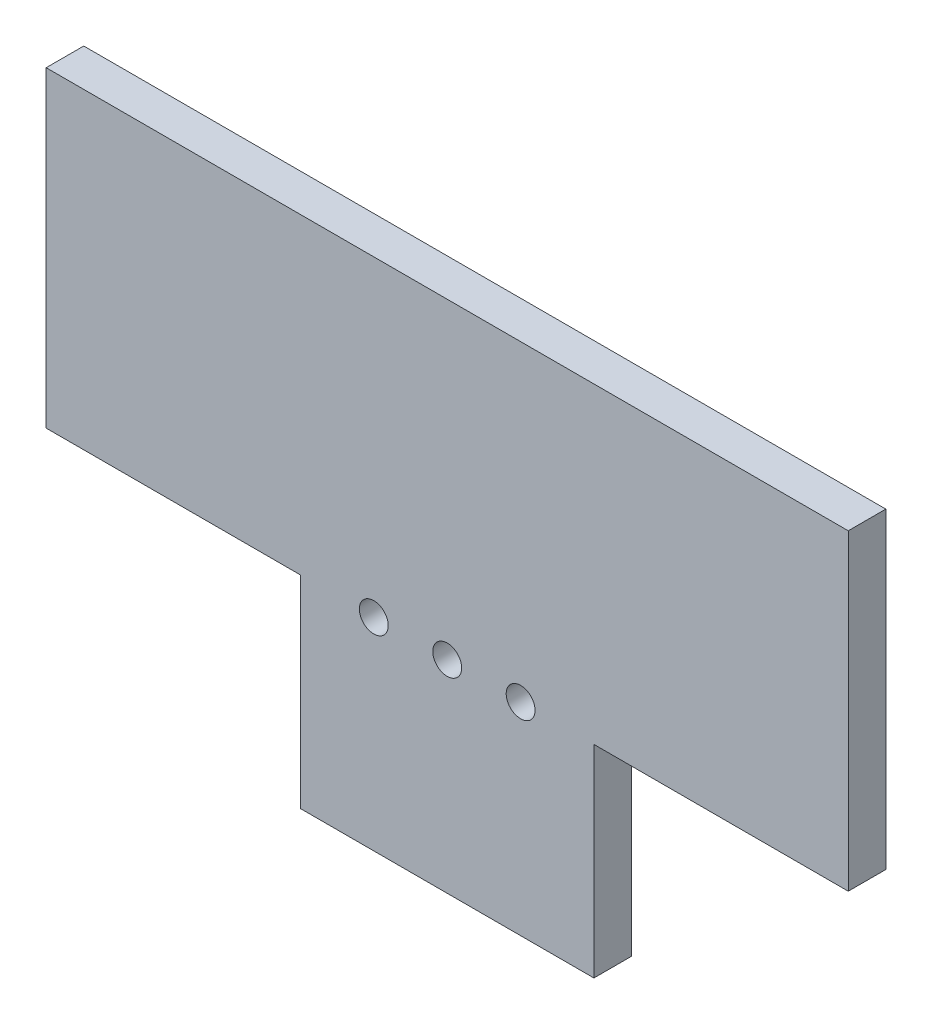
ISO-10303-21;
HEADER;
FILE_DESCRIPTION(('STEP AP214'),'2;1');
FILE_NAME('part.step','',(''),(''),'','','');
FILE_SCHEMA(('AUTOMOTIVE_DESIGN { 1 0 10303 214 1 1 1 1 }'));
ENDSEC;
DATA;
#1=APPLICATION_CONTEXT('core data for automotive mechanical design processes');
#2=APPLICATION_PROTOCOL_DEFINITION('international standard','automotive_design',2000,#1);
#3=PRODUCT_CONTEXT('',#1,'mechanical');
#4=PRODUCT('Part','Part','',(#3));
#5=PRODUCT_RELATED_PRODUCT_CATEGORY('part','',(#4));
#6=PRODUCT_DEFINITION_FORMATION('','',#4);
#7=PRODUCT_DEFINITION_CONTEXT('part definition',#1,'design');
#8=PRODUCT_DEFINITION('design','',#6,#7);
#9=PRODUCT_DEFINITION_SHAPE('','',#8);
#10=(LENGTH_UNIT() NAMED_UNIT(*) SI_UNIT(.MILLI.,.METRE.));
#11=(NAMED_UNIT(*) PLANE_ANGLE_UNIT() SI_UNIT($,.RADIAN.));
#12=(NAMED_UNIT(*) SI_UNIT($,.STERADIAN.) SOLID_ANGLE_UNIT());
#13=UNCERTAINTY_MEASURE_WITH_UNIT(LENGTH_MEASURE(1.E-05),#10,'distance_accuracy_value','');
#14=(GEOMETRIC_REPRESENTATION_CONTEXT(3) GLOBAL_UNCERTAINTY_ASSIGNED_CONTEXT((#13)) GLOBAL_UNIT_ASSIGNED_CONTEXT((#10,
#11,#12)) REPRESENTATION_CONTEXT('',''));
#15=CARTESIAN_POINT('',(0.,0.,0.));
#16=DIRECTION('',(0.,0.,1.));
#17=DIRECTION('',(1.,0.,0.));
#18=AXIS2_PLACEMENT_3D('',#15,#16,#17);
#19=CARTESIAN_POINT('',(-5.075,-12.4,0.65));
#20=DIRECTION('',(0.,1.,0.));
#21=DIRECTION('',(0.,0.,1.));
#22=AXIS2_PLACEMENT_3D('',#19,#20,#21);
#23=PLANE('',#22);
#24=DIRECTION('',(1.,0.,0.));
#25=VECTOR('',#24,1.);
#26=CARTESIAN_POINT('',(-5.075,-12.4,-0.65));
#27=LINE('',#26,#25);
#28=CARTESIAN_POINT('',(-5.075,-12.4,-0.65));
#29=VERTEX_POINT('',#28);
#30=CARTESIAN_POINT('',(5.075,-12.4,-0.65));
#31=VERTEX_POINT('',#30);
#32=EDGE_CURVE('E132',#29,#31,#27,.T.);
#33=ORIENTED_EDGE('',*,*,#32,.T.);
#34=DIRECTION('',(0.,0.,-1.));
#35=VECTOR('',#34,1.);
#36=CARTESIAN_POINT('',(5.075,-12.4,0.65));
#37=LINE('',#36,#35);
#38=CARTESIAN_POINT('',(5.075,-12.4,0.65));
#39=VERTEX_POINT('',#38);
#40=EDGE_CURVE('E160',#39,#31,#37,.T.);
#41=ORIENTED_EDGE('',*,*,#40,.F.);
#42=DIRECTION('',(1.,0.,0.));
#43=VECTOR('',#42,1.);
#44=CARTESIAN_POINT('',(-5.075,-12.4,0.65));
#45=LINE('',#44,#43);
#46=CARTESIAN_POINT('',(-5.075,-12.4,0.65));
#47=VERTEX_POINT('',#46);
#48=EDGE_CURVE('E147',#47,#39,#45,.T.);
#49=ORIENTED_EDGE('',*,*,#48,.F.);
#50=DIRECTION('',(0.,0.,-1.));
#51=VECTOR('',#50,1.);
#52=CARTESIAN_POINT('',(-5.075,-12.4,0.65));
#53=LINE('',#52,#51);
#54=EDGE_CURVE('E128',#47,#29,#53,.T.);
#55=ORIENTED_EDGE('',*,*,#54,.T.);
#56=EDGE_LOOP('',(#33,#41,#49,#55));
#57=FACE_BOUND('',#56,.T.);
#58=ADVANCED_FACE('F33',(#57),#23,.F.);
#59=CARTESIAN_POINT('',(5.075,-12.4,0.65));
#60=DIRECTION('',(-1.,0.,0.));
#61=DIRECTION('',(0.,0.,1.));
#62=AXIS2_PLACEMENT_3D('',#59,#60,#61);
#63=PLANE('',#62);
#64=DIRECTION('',(0.,1.,0.));
#65=VECTOR('',#64,1.);
#66=CARTESIAN_POINT('',(5.075,-12.4,-0.65));
#67=LINE('',#66,#65);
#68=CARTESIAN_POINT('',(5.075,-5.4,-0.65));
#69=VERTEX_POINT('',#68);
#70=EDGE_CURVE('E135',#31,#69,#67,.T.);
#71=ORIENTED_EDGE('',*,*,#70,.T.);
#72=DIRECTION('',(0.,0.,-1.));
#73=VECTOR('',#72,1.);
#74=CARTESIAN_POINT('',(5.075,-5.4,0.65));
#75=LINE('',#74,#73);
#76=CARTESIAN_POINT('',(5.075,-5.4,0.65));
#77=VERTEX_POINT('',#76);
#78=EDGE_CURVE('E157',#77,#69,#75,.T.);
#79=ORIENTED_EDGE('',*,*,#78,.F.);
#80=DIRECTION('',(0.,1.,0.));
#81=VECTOR('',#80,1.);
#82=CARTESIAN_POINT('',(5.075,-12.4,0.65));
#83=LINE('',#82,#81);
#84=EDGE_CURVE('E94',#39,#77,#83,.T.);
#85=ORIENTED_EDGE('',*,*,#84,.F.);
#86=ORIENTED_EDGE('',*,*,#40,.T.);
#87=EDGE_LOOP('',(#71,#79,#85,#86));
#88=FACE_BOUND('',#87,.T.);
#89=ADVANCED_FACE('F182',(#88),#63,.F.);
#90=CARTESIAN_POINT('',(5.075,-5.4,0.65));
#91=DIRECTION('',(0.,1.,0.));
#92=DIRECTION('',(0.,0.,1.));
#93=AXIS2_PLACEMENT_3D('',#90,#91,#92);
#94=PLANE('',#93);
#95=DIRECTION('',(1.,0.,0.));
#96=VECTOR('',#95,1.);
#97=CARTESIAN_POINT('',(5.075,-5.4,-0.65));
#98=LINE('',#97,#96);
#99=CARTESIAN_POINT('',(13.875,-5.4,-0.65));
#100=VERTEX_POINT('',#99);
#101=EDGE_CURVE('E138',#69,#100,#98,.T.);
#102=ORIENTED_EDGE('',*,*,#101,.T.);
#103=DIRECTION('',(0.,0.,-1.));
#104=VECTOR('',#103,1.);
#105=CARTESIAN_POINT('',(13.875,-5.4,0.65));
#106=LINE('',#105,#104);
#107=CARTESIAN_POINT('',(13.875,-5.4,0.65));
#108=VERTEX_POINT('',#107);
#109=EDGE_CURVE('E154',#108,#100,#106,.T.);
#110=ORIENTED_EDGE('',*,*,#109,.F.);
#111=DIRECTION('',(1.,0.,0.));
#112=VECTOR('',#111,1.);
#113=CARTESIAN_POINT('',(5.075,-5.4,0.65));
#114=LINE('',#113,#112);
#115=EDGE_CURVE('E267',#77,#108,#114,.T.);
#116=ORIENTED_EDGE('',*,*,#115,.F.);
#117=ORIENTED_EDGE('',*,*,#78,.T.);
#118=EDGE_LOOP('',(#102,#110,#116,#117));
#119=FACE_BOUND('',#118,.T.);
#120=ADVANCED_FACE('F187',(#119),#94,.F.);
#121=CARTESIAN_POINT('',(13.875,-5.4,0.65));
#122=DIRECTION('',(-1.,0.,0.));
#123=DIRECTION('',(0.,0.,1.));
#124=AXIS2_PLACEMENT_3D('',#121,#122,#123);
#125=PLANE('',#124);
#126=DIRECTION('',(0.,1.,0.));
#127=VECTOR('',#126,1.);
#128=CARTESIAN_POINT('',(13.875,-5.4,-0.65));
#129=LINE('',#128,#127);
#130=CARTESIAN_POINT('',(13.875,5.4,-0.65));
#131=VERTEX_POINT('',#130);
#132=EDGE_CURVE('E140',#100,#131,#129,.T.);
#133=ORIENTED_EDGE('',*,*,#132,.T.);
#134=DIRECTION('',(0.,0.,-1.));
#135=VECTOR('',#134,1.);
#136=CARTESIAN_POINT('',(13.875,5.4,0.65));
#137=LINE('',#136,#135);
#138=CARTESIAN_POINT('',(13.875,5.4,0.65));
#139=VERTEX_POINT('',#138);
#140=EDGE_CURVE('E151',#139,#131,#137,.T.);
#141=ORIENTED_EDGE('',*,*,#140,.F.);
#142=DIRECTION('',(0.,1.,0.));
#143=VECTOR('',#142,1.);
#144=CARTESIAN_POINT('',(13.875,-5.4,0.65));
#145=LINE('',#144,#143);
#146=EDGE_CURVE('E269',#108,#139,#145,.T.);
#147=ORIENTED_EDGE('',*,*,#146,.F.);
#148=ORIENTED_EDGE('',*,*,#109,.T.);
#149=EDGE_LOOP('',(#133,#141,#147,#148));
#150=FACE_BOUND('',#149,.T.);
#151=ADVANCED_FACE('F192',(#150),#125,.F.);
#152=CARTESIAN_POINT('',(13.875,5.4,0.65));
#153=DIRECTION('',(0.,-1.,0.));
#154=DIRECTION('',(0.,0.,-1.));
#155=AXIS2_PLACEMENT_3D('',#152,#153,#154);
#156=PLANE('',#155);
#157=DIRECTION('',(-1.,0.,0.));
#158=VECTOR('',#157,1.);
#159=CARTESIAN_POINT('',(13.875,5.4,-0.65));
#160=LINE('',#159,#158);
#161=CARTESIAN_POINT('',(-13.875,5.4,-0.65));
#162=VERTEX_POINT('',#161);
#163=EDGE_CURVE('E142',#131,#162,#160,.T.);
#164=ORIENTED_EDGE('',*,*,#163,.T.);
#165=DIRECTION('',(0.,0.,-1.));
#166=VECTOR('',#165,1.);
#167=CARTESIAN_POINT('',(-13.875,5.4,0.65));
#168=LINE('',#167,#166);
#169=CARTESIAN_POINT('',(-13.875,5.4,0.65));
#170=VERTEX_POINT('',#169);
#171=EDGE_CURVE('E123',#170,#162,#168,.T.);
#172=ORIENTED_EDGE('',*,*,#171,.F.);
#173=DIRECTION('',(-1.,0.,0.));
#174=VECTOR('',#173,1.);
#175=CARTESIAN_POINT('',(13.875,5.4,0.65));
#176=LINE('',#175,#174);
#177=EDGE_CURVE('E114',#139,#170,#176,.T.);
#178=ORIENTED_EDGE('',*,*,#177,.F.);
#179=ORIENTED_EDGE('',*,*,#140,.T.);
#180=EDGE_LOOP('',(#164,#172,#178,#179));
#181=FACE_BOUND('',#180,.T.);
#182=ADVANCED_FACE('F196',(#181),#156,.F.);
#183=CARTESIAN_POINT('',(-13.875,5.4,0.65));
#184=DIRECTION('',(1.,0.,0.));
#185=DIRECTION('',(0.,0.,-1.));
#186=AXIS2_PLACEMENT_3D('',#183,#184,#185);
#187=PLANE('',#186);
#188=DIRECTION('',(0.,-1.,0.));
#189=VECTOR('',#188,1.);
#190=CARTESIAN_POINT('',(-13.875,5.4,-0.65));
#191=LINE('',#190,#189);
#192=CARTESIAN_POINT('',(-13.875,-5.4,-0.65));
#193=VERTEX_POINT('',#192);
#194=EDGE_CURVE('E122',#162,#193,#191,.T.);
#195=ORIENTED_EDGE('',*,*,#194,.T.);
#196=DIRECTION('',(0.,0.,-1.));
#197=VECTOR('',#196,1.);
#198=CARTESIAN_POINT('',(-13.875,-5.4,0.65));
#199=LINE('',#198,#197);
#200=CARTESIAN_POINT('',(-13.875,-5.4,0.65));
#201=VERTEX_POINT('',#200);
#202=EDGE_CURVE('E119',#201,#193,#199,.T.);
#203=ORIENTED_EDGE('',*,*,#202,.F.);
#204=DIRECTION('',(0.,-1.,0.));
#205=VECTOR('',#204,1.);
#206=CARTESIAN_POINT('',(-13.875,5.4,0.65));
#207=LINE('',#206,#205);
#208=EDGE_CURVE('E107',#170,#201,#207,.T.);
#209=ORIENTED_EDGE('',*,*,#208,.F.);
#210=ORIENTED_EDGE('',*,*,#171,.T.);
#211=EDGE_LOOP('',(#195,#203,#209,#210));
#212=FACE_BOUND('',#211,.T.);
#213=ADVANCED_FACE('F120',(#212),#187,.F.);
#214=CARTESIAN_POINT('',(-13.875,-5.4,0.65));
#215=DIRECTION('',(0.,1.,0.));
#216=DIRECTION('',(0.,0.,1.));
#217=AXIS2_PLACEMENT_3D('',#214,#215,#216);
#218=PLANE('',#217);
#219=DIRECTION('',(1.,0.,0.));
#220=VECTOR('',#219,1.);
#221=CARTESIAN_POINT('',(-13.875,-5.4,-0.65));
#222=LINE('',#221,#220);
#223=CARTESIAN_POINT('',(-5.075,-5.4,-0.65));
#224=VERTEX_POINT('',#223);
#225=EDGE_CURVE('E79',#193,#224,#222,.T.);
#226=ORIENTED_EDGE('',*,*,#225,.T.);
#227=DIRECTION('',(0.,0.,-1.));
#228=VECTOR('',#227,1.);
#229=CARTESIAN_POINT('',(-5.075,-5.4,0.65));
#230=LINE('',#229,#228);
#231=CARTESIAN_POINT('',(-5.075,-5.4,0.65));
#232=VERTEX_POINT('',#231);
#233=EDGE_CURVE('E124',#232,#224,#230,.T.);
#234=ORIENTED_EDGE('',*,*,#233,.F.);
#235=DIRECTION('',(1.,0.,0.));
#236=VECTOR('',#235,1.);
#237=CARTESIAN_POINT('',(-13.875,-5.4,0.65));
#238=LINE('',#237,#236);
#239=EDGE_CURVE('E112',#201,#232,#238,.T.);
#240=ORIENTED_EDGE('',*,*,#239,.F.);
#241=ORIENTED_EDGE('',*,*,#202,.T.);
#242=EDGE_LOOP('',(#226,#234,#240,#241));
#243=FACE_BOUND('',#242,.T.);
#244=ADVANCED_FACE('F126',(#243),#218,.F.);
#245=CARTESIAN_POINT('',(-5.075,-5.4,0.65));
#246=DIRECTION('',(1.,0.,0.));
#247=DIRECTION('',(0.,0.,-1.));
#248=AXIS2_PLACEMENT_3D('',#245,#246,#247);
#249=PLANE('',#248);
#250=DIRECTION('',(0.,-1.,0.));
#251=VECTOR('',#250,1.);
#252=CARTESIAN_POINT('',(-5.075,-5.4,-0.65));
#253=LINE('',#252,#251);
#254=EDGE_CURVE('E85',#224,#29,#253,.T.);
#255=ORIENTED_EDGE('',*,*,#254,.T.);
#256=ORIENTED_EDGE('',*,*,#54,.F.);
#257=DIRECTION('',(0.,-1.,0.));
#258=VECTOR('',#257,1.);
#259=CARTESIAN_POINT('',(-5.075,-5.4,0.65));
#260=LINE('',#259,#258);
#261=EDGE_CURVE('E50',#232,#47,#260,.T.);
#262=ORIENTED_EDGE('',*,*,#261,.F.);
#263=ORIENTED_EDGE('',*,*,#233,.T.);
#264=EDGE_LOOP('',(#255,#256,#262,#263));
#265=FACE_BOUND('',#264,.T.);
#266=ADVANCED_FACE('F167',(#265),#249,.F.);
#267=CARTESIAN_POINT('',(5.075,-12.4,0.65));
#268=DIRECTION('',(0.,0.,1.));
#269=DIRECTION('',(1.,0.,0.));
#270=AXIS2_PLACEMENT_3D('',#267,#268,#269);
#271=PLANE('',#270);
#272=CARTESIAN_POINT('',(0.,-5.4,0.65));
#273=DIRECTION('',(0.,0.,1.));
#274=DIRECTION('',(1.,0.,0.));
#275=AXIS2_PLACEMENT_3D('',#272,#273,#274);
#276=CIRCLE('',#275,0.5);
#277=CARTESIAN_POINT('',(0.499999999999997,-5.4,0.65));
#278=VERTEX_POINT('',#277);
#279=EDGE_CURVE('E253',#278,#278,#276,.T.);
#280=ORIENTED_EDGE('',*,*,#279,.F.);
#281=EDGE_LOOP('',(#280));
#282=FACE_BOUND('',#281,.T.);
#283=CARTESIAN_POINT('',(2.54,-5.4,0.65));
#284=DIRECTION('',(0.,0.,1.));
#285=DIRECTION('',(1.,0.,0.));
#286=AXIS2_PLACEMENT_3D('',#283,#284,#285);
#287=CIRCLE('',#286,0.5);
#288=CARTESIAN_POINT('',(3.04,-5.4,0.65));
#289=VERTEX_POINT('',#288);
#290=EDGE_CURVE('E257',#289,#289,#287,.T.);
#291=ORIENTED_EDGE('',*,*,#290,.F.);
#292=EDGE_LOOP('',(#291));
#293=FACE_BOUND('',#292,.T.);
#294=ORIENTED_EDGE('',*,*,#48,.T.);
#295=ORIENTED_EDGE('',*,*,#84,.T.);
#296=ORIENTED_EDGE('',*,*,#115,.T.);
#297=ORIENTED_EDGE('',*,*,#146,.T.);
#298=ORIENTED_EDGE('',*,*,#177,.T.);
#299=ORIENTED_EDGE('',*,*,#208,.T.);
#300=ORIENTED_EDGE('',*,*,#239,.T.);
#301=ORIENTED_EDGE('',*,*,#261,.T.);
#302=EDGE_LOOP('',(#294,#295,#296,#297,#298,#299,#300,#301));
#303=FACE_BOUND('',#302,.T.);
#304=CARTESIAN_POINT('',(-2.54,-5.4,0.65));
#305=DIRECTION('',(0.,0.,1.));
#306=DIRECTION('',(1.,0.,0.));
#307=AXIS2_PLACEMENT_3D('',#304,#305,#306);
#308=CIRCLE('',#307,0.5);
#309=CARTESIAN_POINT('',(-2.04,-5.4,0.65));
#310=VERTEX_POINT('',#309);
#311=EDGE_CURVE('E42',#310,#310,#308,.T.);
#312=ORIENTED_EDGE('',*,*,#311,.F.);
#313=EDGE_LOOP('',(#312));
#314=FACE_BOUND('',#313,.T.);
#315=ADVANCED_FACE('F109',(#282,#293,#303,#314),#271,.T.);
#316=CARTESIAN_POINT('',(5.075,-12.4,-0.65));
#317=DIRECTION('',(0.,0.,1.));
#318=DIRECTION('',(1.,0.,0.));
#319=AXIS2_PLACEMENT_3D('',#316,#317,#318);
#320=PLANE('',#319);
#321=CARTESIAN_POINT('',(0.,-5.4,-0.65));
#322=DIRECTION('',(0.,0.,1.));
#323=DIRECTION('',(1.,0.,0.));
#324=AXIS2_PLACEMENT_3D('',#321,#322,#323);
#325=CIRCLE('',#324,0.5);
#326=CARTESIAN_POINT('',(0.499999999999997,-5.4,-0.65));
#327=VERTEX_POINT('',#326);
#328=EDGE_CURVE('E256',#327,#327,#325,.F.);
#329=ORIENTED_EDGE('',*,*,#328,.F.);
#330=EDGE_LOOP('',(#329));
#331=FACE_BOUND('',#330,.T.);
#332=CARTESIAN_POINT('',(2.54,-5.4,-0.65));
#333=DIRECTION('',(0.,0.,1.));
#334=DIRECTION('',(1.,0.,0.));
#335=AXIS2_PLACEMENT_3D('',#332,#333,#334);
#336=CIRCLE('',#335,0.5);
#337=CARTESIAN_POINT('',(3.04,-5.4,-0.65));
#338=VERTEX_POINT('',#337);
#339=EDGE_CURVE('E136',#338,#338,#336,.F.);
#340=ORIENTED_EDGE('',*,*,#339,.F.);
#341=EDGE_LOOP('',(#340));
#342=FACE_BOUND('',#341,.T.);
#343=ORIENTED_EDGE('',*,*,#32,.F.);
#344=ORIENTED_EDGE('',*,*,#254,.F.);
#345=ORIENTED_EDGE('',*,*,#225,.F.);
#346=ORIENTED_EDGE('',*,*,#194,.F.);
#347=ORIENTED_EDGE('',*,*,#163,.F.);
#348=ORIENTED_EDGE('',*,*,#132,.F.);
#349=ORIENTED_EDGE('',*,*,#101,.F.);
#350=ORIENTED_EDGE('',*,*,#70,.F.);
#351=EDGE_LOOP('',(#343,#344,#345,#346,#347,#348,#349,#350));
#352=FACE_BOUND('',#351,.T.);
#353=CARTESIAN_POINT('',(-2.54,-5.4,-0.65));
#354=DIRECTION('',(0.,0.,1.));
#355=DIRECTION('',(1.,0.,0.));
#356=AXIS2_PLACEMENT_3D('',#353,#354,#355);
#357=CIRCLE('',#356,0.5);
#358=CARTESIAN_POINT('',(-2.04,-5.4,-0.65));
#359=VERTEX_POINT('',#358);
#360=EDGE_CURVE('E11',#359,#359,#357,.F.);
#361=ORIENTED_EDGE('',*,*,#360,.F.);
#362=EDGE_LOOP('',(#361));
#363=FACE_BOUND('',#362,.T.);
#364=ADVANCED_FACE('F166',(#331,#342,#352,#363),#320,.F.);
#365=CARTESIAN_POINT('',(2.54,-5.4,-0.651));
#366=DIRECTION('',(0.,0.,1.));
#367=DIRECTION('',(1.,0.,0.));
#368=AXIS2_PLACEMENT_3D('',#365,#366,#367);
#369=CYLINDRICAL_SURFACE('',#368,0.5);
#370=ORIENTED_EDGE('',*,*,#290,.T.);
#371=EDGE_LOOP('',(#370));
#372=FACE_BOUND('',#371,.T.);
#373=ORIENTED_EDGE('',*,*,#339,.T.);
#374=EDGE_LOOP('',(#373));
#375=FACE_BOUND('',#374,.T.);
#376=ADVANCED_FACE('F174',(#372,#375),#369,.F.);
#377=CARTESIAN_POINT('',(0.,-5.4,-0.651));
#378=DIRECTION('',(0.,0.,1.));
#379=DIRECTION('',(1.,0.,0.));
#380=AXIS2_PLACEMENT_3D('',#377,#378,#379);
#381=CYLINDRICAL_SURFACE('',#380,0.5);
#382=ORIENTED_EDGE('',*,*,#279,.T.);
#383=EDGE_LOOP('',(#382));
#384=FACE_BOUND('',#383,.T.);
#385=ORIENTED_EDGE('',*,*,#328,.T.);
#386=EDGE_LOOP('',(#385));
#387=FACE_BOUND('',#386,.T.);
#388=ADVANCED_FACE('F221',(#384,#387),#381,.F.);
#389=CARTESIAN_POINT('',(-2.54,-5.4,-0.651));
#390=DIRECTION('',(0.,0.,1.));
#391=DIRECTION('',(1.,0.,0.));
#392=AXIS2_PLACEMENT_3D('',#389,#390,#391);
#393=CYLINDRICAL_SURFACE('',#392,0.5);
#394=ORIENTED_EDGE('',*,*,#311,.T.);
#395=EDGE_LOOP('',(#394));
#396=FACE_BOUND('',#395,.T.);
#397=ORIENTED_EDGE('',*,*,#360,.T.);
#398=EDGE_LOOP('',(#397));
#399=FACE_BOUND('',#398,.T.);
#400=ADVANCED_FACE('F35',(#396,#399),#393,.F.);
#401=CLOSED_SHELL('',(#58,#89,#120,#151,#182,#213,#244,#266,#315,#364,#376,#388,#400));
#402=MANIFOLD_SOLID_BREP('B2',#401);
#403=ADVANCED_BREP_SHAPE_REPRESENTATION('',(#18,#402),#14);
#404=SHAPE_DEFINITION_REPRESENTATION(#9,#403);
ENDSEC;
END-ISO-10303-21;
